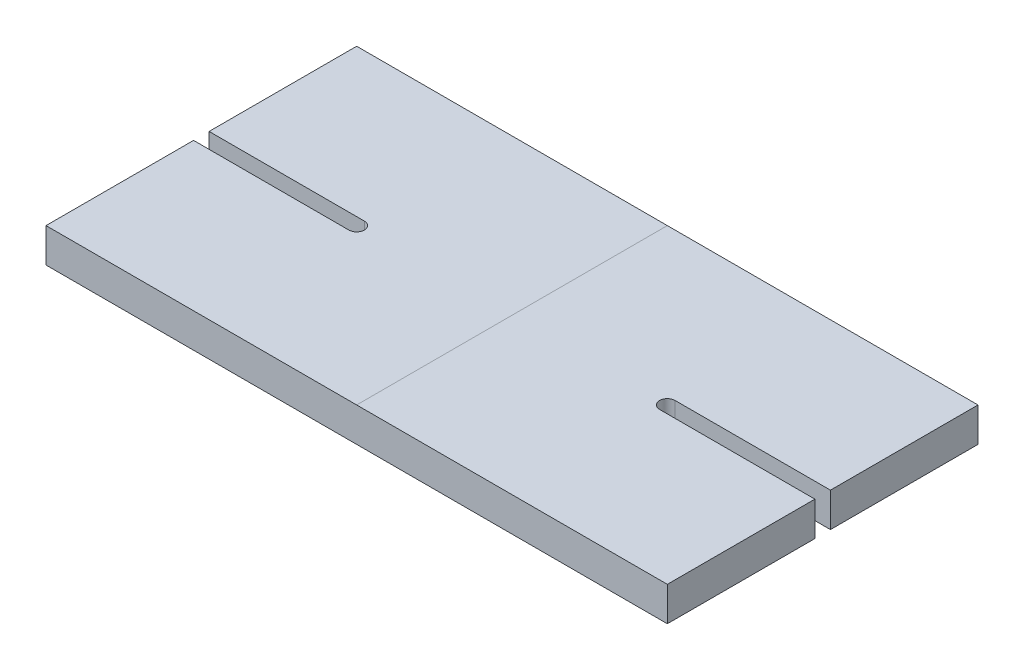
ISO-10303-21;
HEADER;
FILE_DESCRIPTION(('STEP AP214'),'2;1');
FILE_NAME('part.step','',(''),(''),'','','');
FILE_SCHEMA(('AUTOMOTIVE_DESIGN { 1 0 10303 214 1 1 1 1 }'));
ENDSEC;
DATA;
#1=APPLICATION_CONTEXT('core data for automotive mechanical design processes');
#2=APPLICATION_PROTOCOL_DEFINITION('international standard','automotive_design',2000,#1);
#3=PRODUCT_CONTEXT('',#1,'mechanical');
#4=PRODUCT('Part','Part','',(#3));
#5=PRODUCT_RELATED_PRODUCT_CATEGORY('part','',(#4));
#6=PRODUCT_DEFINITION_FORMATION('','',#4);
#7=PRODUCT_DEFINITION_CONTEXT('part definition',#1,'design');
#8=PRODUCT_DEFINITION('design','',#6,#7);
#9=PRODUCT_DEFINITION_SHAPE('','',#8);
#10=(LENGTH_UNIT() NAMED_UNIT(*) SI_UNIT(.MILLI.,.METRE.));
#11=(NAMED_UNIT(*) PLANE_ANGLE_UNIT() SI_UNIT($,.RADIAN.));
#12=(NAMED_UNIT(*) SI_UNIT($,.STERADIAN.) SOLID_ANGLE_UNIT());
#13=UNCERTAINTY_MEASURE_WITH_UNIT(LENGTH_MEASURE(1.E-05),#10,'distance_accuracy_value','');
#14=(GEOMETRIC_REPRESENTATION_CONTEXT(3) GLOBAL_UNCERTAINTY_ASSIGNED_CONTEXT((#13)) GLOBAL_UNIT_ASSIGNED_CONTEXT((#10,
#11,#12)) REPRESENTATION_CONTEXT('',''));
#15=CARTESIAN_POINT('',(0.,0.,0.));
#16=DIRECTION('',(0.,0.,1.));
#17=DIRECTION('',(1.,0.,0.));
#18=AXIS2_PLACEMENT_3D('',#15,#16,#17);
#19=CARTESIAN_POINT('',(0.,1000.,0.));
#20=DIRECTION('',(0.,1.,0.));
#21=DIRECTION('',(1.,0.,0.));
#22=AXIS2_PLACEMENT_3D('',#19,#20,#21);
#23=PLANE('',#22);
#24=DIRECTION('',(0.,0.,1.));
#25=VECTOR('',#24,1.);
#26=CARTESIAN_POINT('',(0.,1000.,0.));
#27=LINE('',#26,#25);
#28=CARTESIAN_POINT('',(0.,1000.,-100.));
#29=VERTEX_POINT('',#28);
#30=CARTESIAN_POINT('',(0.,1000.,100.));
#31=VERTEX_POINT('',#30);
#32=EDGE_CURVE('E42',#29,#31,#27,.T.);
#33=ORIENTED_EDGE('',*,*,#32,.F.);
#34=DIRECTION('',(-1.,0.,0.));
#35=VECTOR('',#34,1.);
#36=CARTESIAN_POINT('',(200.,1000.,-100.));
#37=LINE('',#36,#35);
#38=CARTESIAN_POINT('',(-200.,1000.,-100.));
#39=VERTEX_POINT('',#38);
#40=EDGE_CURVE('E11',#29,#39,#37,.T.);
#41=ORIENTED_EDGE('',*,*,#40,.T.);
#42=DIRECTION('',(0.,0.,1.));
#43=VECTOR('',#42,1.);
#44=CARTESIAN_POINT('',(-200.,1000.,-100.));
#45=LINE('',#44,#43);
#46=CARTESIAN_POINT('',(-200.,1000.,-5.));
#47=VERTEX_POINT('',#46);
#48=EDGE_CURVE('E29',#39,#47,#45,.T.);
#49=ORIENTED_EDGE('',*,*,#48,.T.);
#50=DIRECTION('',(-1.,0.,0.));
#51=VECTOR('',#50,1.);
#52=CARTESIAN_POINT('',(-100.,1000.,-5.));
#53=LINE('',#52,#51);
#54=CARTESIAN_POINT('',(-100.,1000.,-5.));
#55=VERTEX_POINT('',#54);
#56=EDGE_CURVE('E195',#55,#47,#53,.T.);
#57=ORIENTED_EDGE('',*,*,#56,.F.);
#58=CARTESIAN_POINT('',(-100.,1000.,0.));
#59=DIRECTION('',(0.,1.,0.));
#60=DIRECTION('',(0.,0.,1.));
#61=AXIS2_PLACEMENT_3D('',#58,#59,#60);
#62=CIRCLE('',#61,5.);
#63=CARTESIAN_POINT('',(-100.,1000.,5.));
#64=VERTEX_POINT('',#63);
#65=EDGE_CURVE('E200',#64,#55,#62,.T.);
#66=ORIENTED_EDGE('',*,*,#65,.F.);
#67=DIRECTION('',(1.,0.,0.));
#68=VECTOR('',#67,1.);
#69=CARTESIAN_POINT('',(-200.,1000.,5.));
#70=LINE('',#69,#68);
#71=CARTESIAN_POINT('',(-200.,1000.,5.));
#72=VERTEX_POINT('',#71);
#73=EDGE_CURVE('E229',#72,#64,#70,.T.);
#74=ORIENTED_EDGE('',*,*,#73,.F.);
#75=DIRECTION('',(0.,0.,1.));
#76=VECTOR('',#75,1.);
#77=CARTESIAN_POINT('',(-200.,1000.,-100.));
#78=LINE('',#77,#76);
#79=CARTESIAN_POINT('',(-200.,1000.,100.));
#80=VERTEX_POINT('',#79);
#81=EDGE_CURVE('E170',#72,#80,#78,.T.);
#82=ORIENTED_EDGE('',*,*,#81,.T.);
#83=DIRECTION('',(1.,0.,0.));
#84=VECTOR('',#83,1.);
#85=CARTESIAN_POINT('',(-200.,1000.,100.));
#86=LINE('',#85,#84);
#87=EDGE_CURVE('E168',#80,#31,#86,.T.);
#88=ORIENTED_EDGE('',*,*,#87,.T.);
#89=EDGE_LOOP('',(#33,#41,#49,#57,#66,#74,#82,#88));
#90=FACE_BOUND('',#89,.T.);
#91=ADVANCED_FACE('F18',(#90),#23,.T.);
#92=CARTESIAN_POINT('',(-200.,1000.,-100.));
#93=DIRECTION('',(0.,0.,-1.));
#94=DIRECTION('',(0.,-1.,0.));
#95=AXIS2_PLACEMENT_3D('',#92,#93,#94);
#96=PLANE('',#95);
#97=DIRECTION('',(-1.,0.,0.));
#98=VECTOR('',#97,1.);
#99=CARTESIAN_POINT('',(200.,1000.,-100.));
#100=LINE('',#99,#98);
#101=CARTESIAN_POINT('',(200.,1000.,-100.));
#102=VERTEX_POINT('',#101);
#103=EDGE_CURVE('E163',#102,#29,#100,.T.);
#104=ORIENTED_EDGE('',*,*,#103,.F.);
#105=DIRECTION('',(0.,-1.,0.));
#106=VECTOR('',#105,1.);
#107=CARTESIAN_POINT('',(200.,1000.,-100.));
#108=LINE('',#107,#106);
#109=CARTESIAN_POINT('',(200.,978.,-100.));
#110=VERTEX_POINT('',#109);
#111=EDGE_CURVE('E175',#102,#110,#108,.T.);
#112=ORIENTED_EDGE('',*,*,#111,.T.);
#113=DIRECTION('',(1.,0.,0.));
#114=VECTOR('',#113,1.);
#115=CARTESIAN_POINT('',(200.,978.,-100.));
#116=LINE('',#115,#114);
#117=CARTESIAN_POINT('',(-200.,978.,-100.));
#118=VERTEX_POINT('',#117);
#119=EDGE_CURVE('E222',#118,#110,#116,.T.);
#120=ORIENTED_EDGE('',*,*,#119,.F.);
#121=DIRECTION('',(0.,-1.,0.));
#122=VECTOR('',#121,1.);
#123=CARTESIAN_POINT('',(-200.,1000.,-100.));
#124=LINE('',#123,#122);
#125=EDGE_CURVE('E192',#39,#118,#124,.T.);
#126=ORIENTED_EDGE('',*,*,#125,.F.);
#127=ORIENTED_EDGE('',*,*,#40,.F.);
#128=EDGE_LOOP('',(#104,#112,#120,#126,#127));
#129=FACE_BOUND('',#128,.T.);
#130=ADVANCED_FACE('F20',(#129),#96,.T.);
#131=CARTESIAN_POINT('',(-200.,1000.,-5.));
#132=DIRECTION('',(-1.,0.,0.));
#133=DIRECTION('',(0.,0.,1.));
#134=AXIS2_PLACEMENT_3D('',#131,#132,#133);
#135=PLANE('',#134);
#136=ORIENTED_EDGE('',*,*,#48,.F.);
#137=ORIENTED_EDGE('',*,*,#125,.T.);
#138=DIRECTION('',(0.,0.,-1.));
#139=VECTOR('',#138,1.);
#140=CARTESIAN_POINT('',(-200.,978.,-100.));
#141=LINE('',#140,#139);
#142=CARTESIAN_POINT('',(-200.,978.,-5.));
#143=VERTEX_POINT('',#142);
#144=EDGE_CURVE('E154',#143,#118,#141,.T.);
#145=ORIENTED_EDGE('',*,*,#144,.F.);
#146=DIRECTION('',(0.,-1.,0.));
#147=VECTOR('',#146,1.);
#148=CARTESIAN_POINT('',(-200.,1000.,-5.));
#149=LINE('',#148,#147);
#150=EDGE_CURVE('E204',#47,#143,#149,.T.);
#151=ORIENTED_EDGE('',*,*,#150,.F.);
#152=EDGE_LOOP('',(#136,#137,#145,#151));
#153=FACE_BOUND('',#152,.T.);
#154=ADVANCED_FACE('F540',(#153),#135,.T.);
#155=CARTESIAN_POINT('',(-100.,1000.,-5.));
#156=DIRECTION('',(0.,0.,1.));
#157=DIRECTION('',(1.,0.,0.));
#158=AXIS2_PLACEMENT_3D('',#155,#156,#157);
#159=PLANE('',#158);
#160=ORIENTED_EDGE('',*,*,#56,.T.);
#161=ORIENTED_EDGE('',*,*,#150,.T.);
#162=DIRECTION('',(-1.,0.,0.));
#163=VECTOR('',#162,1.);
#164=CARTESIAN_POINT('',(-100.,978.,-5.));
#165=LINE('',#164,#163);
#166=CARTESIAN_POINT('',(-100.,978.,-5.));
#167=VERTEX_POINT('',#166);
#168=EDGE_CURVE('E142',#167,#143,#165,.T.);
#169=ORIENTED_EDGE('',*,*,#168,.F.);
#170=DIRECTION('',(0.,-1.,0.));
#171=VECTOR('',#170,1.);
#172=CARTESIAN_POINT('',(-100.,1000.,-5.));
#173=LINE('',#172,#171);
#174=EDGE_CURVE('E205',#55,#167,#173,.T.);
#175=ORIENTED_EDGE('',*,*,#174,.F.);
#176=EDGE_LOOP('',(#160,#161,#169,#175));
#177=FACE_BOUND('',#176,.T.);
#178=ADVANCED_FACE('F529',(#177),#159,.T.);
#179=CARTESIAN_POINT('',(-100.,1000.,0.));
#180=DIRECTION('',(0.,-1.,0.));
#181=DIRECTION('',(0.,0.,1.));
#182=AXIS2_PLACEMENT_3D('',#179,#180,#181);
#183=CYLINDRICAL_SURFACE('',#182,5.);
#184=ORIENTED_EDGE('',*,*,#65,.T.);
#185=ORIENTED_EDGE('',*,*,#174,.T.);
#186=CARTESIAN_POINT('',(-100.,978.,0.));
#187=DIRECTION('',(0.,1.,0.));
#188=DIRECTION('',(0.,0.,1.));
#189=AXIS2_PLACEMENT_3D('',#186,#187,#188);
#190=CIRCLE('',#189,5.);
#191=CARTESIAN_POINT('',(-100.,978.,5.));
#192=VERTEX_POINT('',#191);
#193=EDGE_CURVE('E236',#192,#167,#190,.T.);
#194=ORIENTED_EDGE('',*,*,#193,.F.);
#195=DIRECTION('',(0.,-1.,0.));
#196=VECTOR('',#195,1.);
#197=CARTESIAN_POINT('',(-100.,1000.,5.));
#198=LINE('',#197,#196);
#199=EDGE_CURVE('E232',#64,#192,#198,.T.);
#200=ORIENTED_EDGE('',*,*,#199,.F.);
#201=EDGE_LOOP('',(#184,#185,#194,#200));
#202=FACE_BOUND('',#201,.T.);
#203=ADVANCED_FACE('F517',(#202),#183,.F.);
#204=CARTESIAN_POINT('',(-200.,1000.,5.));
#205=DIRECTION('',(0.,0.,-1.));
#206=DIRECTION('',(0.,-1.,0.));
#207=AXIS2_PLACEMENT_3D('',#204,#205,#206);
#208=PLANE('',#207);
#209=ORIENTED_EDGE('',*,*,#73,.T.);
#210=ORIENTED_EDGE('',*,*,#199,.T.);
#211=DIRECTION('',(1.,0.,0.));
#212=VECTOR('',#211,1.);
#213=CARTESIAN_POINT('',(-200.,978.,5.));
#214=LINE('',#213,#212);
#215=CARTESIAN_POINT('',(-200.,978.,5.));
#216=VERTEX_POINT('',#215);
#217=EDGE_CURVE('E228',#216,#192,#214,.T.);
#218=ORIENTED_EDGE('',*,*,#217,.F.);
#219=DIRECTION('',(0.,-1.,0.));
#220=VECTOR('',#219,1.);
#221=CARTESIAN_POINT('',(-200.,1000.,5.));
#222=LINE('',#221,#220);
#223=EDGE_CURVE('E256',#72,#216,#222,.T.);
#224=ORIENTED_EDGE('',*,*,#223,.F.);
#225=EDGE_LOOP('',(#209,#210,#218,#224));
#226=FACE_BOUND('',#225,.T.);
#227=ADVANCED_FACE('F507',(#226),#208,.T.);
#228=CARTESIAN_POINT('',(-200.,1000.,100.));
#229=DIRECTION('',(-1.,0.,0.));
#230=DIRECTION('',(0.,0.,1.));
#231=AXIS2_PLACEMENT_3D('',#228,#229,#230);
#232=PLANE('',#231);
#233=ORIENTED_EDGE('',*,*,#81,.F.);
#234=ORIENTED_EDGE('',*,*,#223,.T.);
#235=DIRECTION('',(0.,0.,-1.));
#236=VECTOR('',#235,1.);
#237=CARTESIAN_POINT('',(-200.,978.,-100.));
#238=LINE('',#237,#236);
#239=CARTESIAN_POINT('',(-200.,978.,100.));
#240=VERTEX_POINT('',#239);
#241=EDGE_CURVE('E223',#240,#216,#238,.T.);
#242=ORIENTED_EDGE('',*,*,#241,.F.);
#243=DIRECTION('',(0.,-1.,0.));
#244=VECTOR('',#243,1.);
#245=CARTESIAN_POINT('',(-200.,1000.,100.));
#246=LINE('',#245,#244);
#247=EDGE_CURVE('E260',#80,#240,#246,.T.);
#248=ORIENTED_EDGE('',*,*,#247,.F.);
#249=EDGE_LOOP('',(#233,#234,#242,#248));
#250=FACE_BOUND('',#249,.T.);
#251=ADVANCED_FACE('F498',(#250),#232,.T.);
#252=CARTESIAN_POINT('',(200.,1000.,100.));
#253=DIRECTION('',(0.,0.,1.));
#254=DIRECTION('',(1.,0.,0.));
#255=AXIS2_PLACEMENT_3D('',#252,#253,#254);
#256=PLANE('',#255);
#257=ORIENTED_EDGE('',*,*,#87,.F.);
#258=ORIENTED_EDGE('',*,*,#247,.T.);
#259=DIRECTION('',(-1.,0.,0.));
#260=VECTOR('',#259,1.);
#261=CARTESIAN_POINT('',(-200.,978.,100.));
#262=LINE('',#261,#260);
#263=CARTESIAN_POINT('',(200.,978.,100.));
#264=VERTEX_POINT('',#263);
#265=EDGE_CURVE('E227',#264,#240,#262,.T.);
#266=ORIENTED_EDGE('',*,*,#265,.F.);
#267=DIRECTION('',(0.,-1.,0.));
#268=VECTOR('',#267,1.);
#269=CARTESIAN_POINT('',(200.,1000.,100.));
#270=LINE('',#269,#268);
#271=CARTESIAN_POINT('',(200.,1000.,100.));
#272=VERTEX_POINT('',#271);
#273=EDGE_CURVE('E180',#272,#264,#270,.T.);
#274=ORIENTED_EDGE('',*,*,#273,.F.);
#275=DIRECTION('',(1.,0.,0.));
#276=VECTOR('',#275,1.);
#277=CARTESIAN_POINT('',(-200.,1000.,100.));
#278=LINE('',#277,#276);
#279=EDGE_CURVE('E160',#31,#272,#278,.T.);
#280=ORIENTED_EDGE('',*,*,#279,.F.);
#281=EDGE_LOOP('',(#257,#258,#266,#274,#280));
#282=FACE_BOUND('',#281,.T.);
#283=ADVANCED_FACE('F177',(#282),#256,.T.);
#284=CARTESIAN_POINT('',(200.,1000.,5.));
#285=DIRECTION('',(1.,0.,0.));
#286=DIRECTION('',(0.,1.,0.));
#287=AXIS2_PLACEMENT_3D('',#284,#285,#286);
#288=PLANE('',#287);
#289=DIRECTION('',(0.,0.,-1.));
#290=VECTOR('',#289,1.);
#291=CARTESIAN_POINT('',(200.,1000.,100.));
#292=LINE('',#291,#290);
#293=CARTESIAN_POINT('',(200.,1000.,5.));
#294=VERTEX_POINT('',#293);
#295=EDGE_CURVE('E90',#272,#294,#292,.T.);
#296=ORIENTED_EDGE('',*,*,#295,.F.);
#297=ORIENTED_EDGE('',*,*,#273,.T.);
#298=DIRECTION('',(0.,0.,1.));
#299=VECTOR('',#298,1.);
#300=CARTESIAN_POINT('',(200.,978.,100.));
#301=LINE('',#300,#299);
#302=CARTESIAN_POINT('',(200.,978.,5.));
#303=VERTEX_POINT('',#302);
#304=EDGE_CURVE('E255',#303,#264,#301,.T.);
#305=ORIENTED_EDGE('',*,*,#304,.F.);
#306=DIRECTION('',(0.,-1.,0.));
#307=VECTOR('',#306,1.);
#308=CARTESIAN_POINT('',(200.,1000.,5.));
#309=LINE('',#308,#307);
#310=EDGE_CURVE('E196',#294,#303,#309,.T.);
#311=ORIENTED_EDGE('',*,*,#310,.F.);
#312=EDGE_LOOP('',(#296,#297,#305,#311));
#313=FACE_BOUND('',#312,.T.);
#314=ADVANCED_FACE('F479',(#313),#288,.T.);
#315=CARTESIAN_POINT('',(100.,1000.,5.));
#316=DIRECTION('',(0.,0.,-1.));
#317=DIRECTION('',(0.,-1.,0.));
#318=AXIS2_PLACEMENT_3D('',#315,#316,#317);
#319=PLANE('',#318);
#320=DIRECTION('',(1.,0.,0.));
#321=VECTOR('',#320,1.);
#322=CARTESIAN_POINT('',(100.,1000.,5.));
#323=LINE('',#322,#321);
#324=CARTESIAN_POINT('',(100.,1000.,5.));
#325=VERTEX_POINT('',#324);
#326=EDGE_CURVE('E22',#325,#294,#323,.T.);
#327=ORIENTED_EDGE('',*,*,#326,.T.);
#328=ORIENTED_EDGE('',*,*,#310,.T.);
#329=DIRECTION('',(1.,0.,0.));
#330=VECTOR('',#329,1.);
#331=CARTESIAN_POINT('',(100.,978.,5.));
#332=LINE('',#331,#330);
#333=CARTESIAN_POINT('',(100.,978.,5.));
#334=VERTEX_POINT('',#333);
#335=EDGE_CURVE('E104',#334,#303,#332,.T.);
#336=ORIENTED_EDGE('',*,*,#335,.F.);
#337=DIRECTION('',(0.,-1.,0.));
#338=VECTOR('',#337,1.);
#339=CARTESIAN_POINT('',(100.,1000.,5.));
#340=LINE('',#339,#338);
#341=EDGE_CURVE('E212',#325,#334,#340,.T.);
#342=ORIENTED_EDGE('',*,*,#341,.F.);
#343=EDGE_LOOP('',(#327,#328,#336,#342));
#344=FACE_BOUND('',#343,.T.);
#345=ADVANCED_FACE('F315',(#344),#319,.T.);
#346=CARTESIAN_POINT('',(100.,1000.,0.));
#347=DIRECTION('',(0.,-1.,0.));
#348=DIRECTION('',(0.,0.,-1.));
#349=AXIS2_PLACEMENT_3D('',#346,#347,#348);
#350=CYLINDRICAL_SURFACE('',#349,5.);
#351=CARTESIAN_POINT('',(100.,1000.,0.));
#352=DIRECTION('',(0.,1.,0.));
#353=DIRECTION('',(0.,0.,-1.));
#354=AXIS2_PLACEMENT_3D('',#351,#352,#353);
#355=CIRCLE('',#354,5.);
#356=CARTESIAN_POINT('',(100.,1000.,-5.));
#357=VERTEX_POINT('',#356);
#358=EDGE_CURVE('E199',#357,#325,#355,.T.);
#359=ORIENTED_EDGE('',*,*,#358,.T.);
#360=ORIENTED_EDGE('',*,*,#341,.T.);
#361=CARTESIAN_POINT('',(100.,978.,0.));
#362=DIRECTION('',(0.,1.,0.));
#363=DIRECTION('',(0.,0.,-1.));
#364=AXIS2_PLACEMENT_3D('',#361,#362,#363);
#365=CIRCLE('',#364,5.);
#366=CARTESIAN_POINT('',(100.,978.,-5.));
#367=VERTEX_POINT('',#366);
#368=EDGE_CURVE('E219',#367,#334,#365,.T.);
#369=ORIENTED_EDGE('',*,*,#368,.F.);
#370=DIRECTION('',(0.,-1.,0.));
#371=VECTOR('',#370,1.);
#372=CARTESIAN_POINT('',(100.,1000.,-5.));
#373=LINE('',#372,#371);
#374=EDGE_CURVE('E209',#357,#367,#373,.T.);
#375=ORIENTED_EDGE('',*,*,#374,.F.);
#376=EDGE_LOOP('',(#359,#360,#369,#375));
#377=FACE_BOUND('',#376,.T.);
#378=ADVANCED_FACE('F314',(#377),#350,.F.);
#379=CARTESIAN_POINT('',(200.,1000.,-5.));
#380=DIRECTION('',(0.,0.,1.));
#381=DIRECTION('',(1.,0.,0.));
#382=AXIS2_PLACEMENT_3D('',#379,#380,#381);
#383=PLANE('',#382);
#384=DIRECTION('',(-1.,0.,0.));
#385=VECTOR('',#384,1.);
#386=CARTESIAN_POINT('',(200.,1000.,-5.));
#387=LINE('',#386,#385);
#388=CARTESIAN_POINT('',(200.,1000.,-5.));
#389=VERTEX_POINT('',#388);
#390=EDGE_CURVE('E249',#389,#357,#387,.T.);
#391=ORIENTED_EDGE('',*,*,#390,.T.);
#392=ORIENTED_EDGE('',*,*,#374,.T.);
#393=DIRECTION('',(-1.,0.,0.));
#394=VECTOR('',#393,1.);
#395=CARTESIAN_POINT('',(200.,978.,-5.));
#396=LINE('',#395,#394);
#397=CARTESIAN_POINT('',(200.,978.,-5.));
#398=VERTEX_POINT('',#397);
#399=EDGE_CURVE('E214',#398,#367,#396,.T.);
#400=ORIENTED_EDGE('',*,*,#399,.F.);
#401=DIRECTION('',(0.,-1.,0.));
#402=VECTOR('',#401,1.);
#403=CARTESIAN_POINT('',(200.,1000.,-5.));
#404=LINE('',#403,#402);
#405=EDGE_CURVE('E165',#389,#398,#404,.T.);
#406=ORIENTED_EDGE('',*,*,#405,.F.);
#407=EDGE_LOOP('',(#391,#392,#400,#406));
#408=FACE_BOUND('',#407,.T.);
#409=ADVANCED_FACE('F303',(#408),#383,.T.);
#410=CARTESIAN_POINT('',(200.,1000.,-100.));
#411=DIRECTION('',(1.,0.,0.));
#412=DIRECTION('',(0.,1.,0.));
#413=AXIS2_PLACEMENT_3D('',#410,#411,#412);
#414=PLANE('',#413);
#415=DIRECTION('',(0.,0.,-1.));
#416=VECTOR('',#415,1.);
#417=CARTESIAN_POINT('',(200.,1000.,100.));
#418=LINE('',#417,#416);
#419=EDGE_CURVE('E187',#389,#102,#418,.T.);
#420=ORIENTED_EDGE('',*,*,#419,.F.);
#421=ORIENTED_EDGE('',*,*,#405,.T.);
#422=DIRECTION('',(0.,0.,1.));
#423=VECTOR('',#422,1.);
#424=CARTESIAN_POINT('',(200.,978.,100.));
#425=LINE('',#424,#423);
#426=EDGE_CURVE('E218',#110,#398,#425,.T.);
#427=ORIENTED_EDGE('',*,*,#426,.F.);
#428=ORIENTED_EDGE('',*,*,#111,.F.);
#429=EDGE_LOOP('',(#420,#421,#427,#428));
#430=FACE_BOUND('',#429,.T.);
#431=ADVANCED_FACE('F312',(#430),#414,.T.);
#432=CARTESIAN_POINT('',(0.,1000.,0.));
#433=DIRECTION('',(0.,1.,0.));
#434=DIRECTION('',(1.,0.,0.));
#435=AXIS2_PLACEMENT_3D('',#432,#433,#434);
#436=PLANE('',#435);
#437=ORIENTED_EDGE('',*,*,#32,.T.);
#438=ORIENTED_EDGE('',*,*,#279,.T.);
#439=ORIENTED_EDGE('',*,*,#295,.T.);
#440=ORIENTED_EDGE('',*,*,#326,.F.);
#441=ORIENTED_EDGE('',*,*,#358,.F.);
#442=ORIENTED_EDGE('',*,*,#390,.F.);
#443=ORIENTED_EDGE('',*,*,#419,.T.);
#444=ORIENTED_EDGE('',*,*,#103,.T.);
#445=EDGE_LOOP('',(#437,#438,#439,#440,#441,#442,#443,#444));
#446=FACE_BOUND('',#445,.T.);
#447=ADVANCED_FACE('F158',(#446),#436,.T.);
#448=CARTESIAN_POINT('',(0.,978.,0.));
#449=DIRECTION('',(0.,1.,0.));
#450=DIRECTION('',(1.,0.,0.));
#451=AXIS2_PLACEMENT_3D('',#448,#449,#450);
#452=PLANE('',#451);
#453=ORIENTED_EDGE('',*,*,#426,.T.);
#454=ORIENTED_EDGE('',*,*,#399,.T.);
#455=ORIENTED_EDGE('',*,*,#368,.T.);
#456=ORIENTED_EDGE('',*,*,#335,.T.);
#457=ORIENTED_EDGE('',*,*,#304,.T.);
#458=ORIENTED_EDGE('',*,*,#265,.T.);
#459=ORIENTED_EDGE('',*,*,#241,.T.);
#460=ORIENTED_EDGE('',*,*,#217,.T.);
#461=ORIENTED_EDGE('',*,*,#193,.T.);
#462=ORIENTED_EDGE('',*,*,#168,.T.);
#463=ORIENTED_EDGE('',*,*,#144,.T.);
#464=ORIENTED_EDGE('',*,*,#119,.T.);
#465=EDGE_LOOP('',(#453,#454,#455,#456,#457,#458,#459,#460,#461,#462,#463,#464));
#466=FACE_BOUND('',#465,.T.);
#467=ADVANCED_FACE('F307',(#466),#452,.F.);
#468=CLOSED_SHELL('',(#91,#130,#154,#178,#203,#227,#251,#283,#314,#345,#378,#409,#431,#447,#467));
#469=MANIFOLD_SOLID_BREP('B1',#468);
#470=ADVANCED_BREP_SHAPE_REPRESENTATION('',(#18,#469),#14);
#471=SHAPE_DEFINITION_REPRESENTATION(#9,#470);
ENDSEC;
END-ISO-10303-21;
